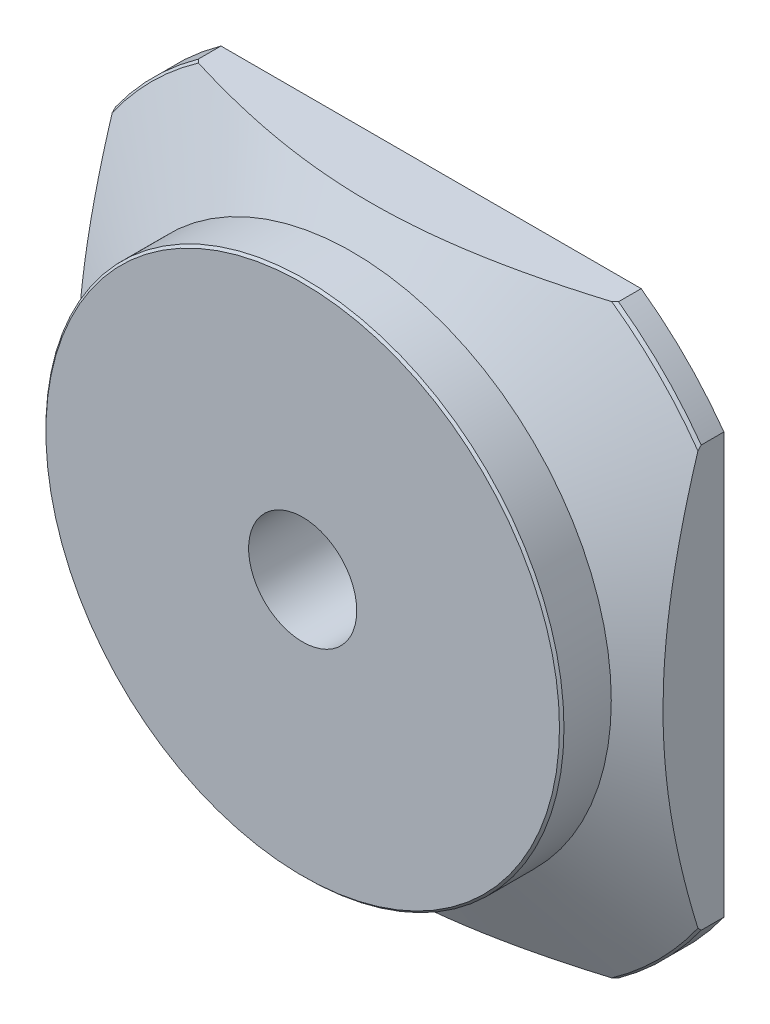
ISO-10303-21;
HEADER;
FILE_DESCRIPTION(('STEP AP214'),'2;1');
FILE_NAME('part.step','',(''),(''),'','','');
FILE_SCHEMA(('AUTOMOTIVE_DESIGN { 1 0 10303 214 1 1 1 1 }'));
ENDSEC;
DATA;
#1=APPLICATION_CONTEXT('core data for automotive mechanical design processes');
#2=APPLICATION_PROTOCOL_DEFINITION('international standard','automotive_design',2000,#1);
#3=PRODUCT_CONTEXT('',#1,'mechanical');
#4=PRODUCT('Part','Part','',(#3));
#5=PRODUCT_RELATED_PRODUCT_CATEGORY('part','',(#4));
#6=PRODUCT_DEFINITION_FORMATION('','',#4);
#7=PRODUCT_DEFINITION_CONTEXT('part definition',#1,'design');
#8=PRODUCT_DEFINITION('design','',#6,#7);
#9=PRODUCT_DEFINITION_SHAPE('','',#8);
#10=(LENGTH_UNIT() NAMED_UNIT(*) SI_UNIT(.MILLI.,.METRE.));
#11=(NAMED_UNIT(*) PLANE_ANGLE_UNIT() SI_UNIT($,.RADIAN.));
#12=(NAMED_UNIT(*) SI_UNIT($,.STERADIAN.) SOLID_ANGLE_UNIT());
#13=UNCERTAINTY_MEASURE_WITH_UNIT(LENGTH_MEASURE(1.E-05),#10,'distance_accuracy_value','');
#14=(GEOMETRIC_REPRESENTATION_CONTEXT(3) GLOBAL_UNCERTAINTY_ASSIGNED_CONTEXT((#13)) GLOBAL_UNIT_ASSIGNED_CONTEXT((#10,
#11,#12)) REPRESENTATION_CONTEXT('',''));
#15=CARTESIAN_POINT('',(0.,0.,0.));
#16=DIRECTION('',(0.,0.,1.));
#17=DIRECTION('',(1.,0.,0.));
#18=AXIS2_PLACEMENT_3D('',#15,#16,#17);
#19=CARTESIAN_POINT('',(-56.241548993449,57.440074272731,-69.2500021457751));
#20=DIRECTION('',(0.,1.,0.));
#21=DIRECTION('',(1.,0.,0.));
#22=AXIS2_PLACEMENT_3D('',#19,#20,#21);
#23=PLANE('',#22);
#24=CARTESIAN_POINT('',(-37.1170194345459,57.440074272731,-63.4787295908975));
#25=CARTESIAN_POINT('',(-31.2651213395303,57.440074272731,-61.6845540548488));
#26=CARTESIAN_POINT('',(-25.8756624168634,57.440074272731,-60.3370850560629));
#27=CARTESIAN_POINT('',(-20.0332533361199,57.440074272731,-58.8763697546775));
#28=CARTESIAN_POINT('',(-14.5372048499931,57.440074272731,-57.8904206273085));
#29=CARTESIAN_POINT('',(-8.6819049125293,57.440074272731,-56.840024533024));
#30=CARTESIAN_POINT('',(-3.0782490660757,57.440074272731,-56.3062009979771));
#31=CARTESIAN_POINT('',(2.7689702034313,57.440074272731,-55.7491747732818));
#32=CARTESIAN_POINT('',(8.52266911888411,57.440074272731,-55.7380522906249));
#33=CARTESIAN_POINT('',(14.3453683191257,57.440074272731,-55.7267964234301));
#34=CARTESIAN_POINT('',(20.2595439132772,57.440074272731,-56.2746703531966));
#35=CARTESIAN_POINT('',(25.9402012395056,57.440074272731,-56.8009117546281));
#36=CARTESIAN_POINT('',(31.8783630092681,57.440074272731,-57.8589996151785));
#37=CARTESIAN_POINT('',(37.4280803220118,57.440074272731,-58.8478727287407));
#38=CARTESIAN_POINT('',(43.3247803967278,57.440074272731,-60.3198828142651));
#39=CARTESIAN_POINT('',(48.7405221048772,57.440074272731,-61.6718298887269));
#40=CARTESIAN_POINT('',(54.6339214476564,57.440074272731,-63.4787295908984));
#41=B_SPLINE_CURVE_WITH_KNOTS('',2,(#24,#25,#26,#27,#28,#29,#30,#31,#32,#33,#34,#35,#36,#37,#38,
#39,#40),.UNSPECIFIED.,.F.,.F.,(3,2,2,2,2,2,2,2,3),(0.,0.125,0.25,0.375,0.5,0.625,0.75,0.875,
1.),.UNSPECIFIED.);
#42=CARTESIAN_POINT('',(-37.1170194345459,57.440074272731,-63.4787295908975));
#43=VERTEX_POINT('',#42);
#44=CARTESIAN_POINT('',(54.6339214476565,57.440074272731,-63.4787295908984));
#45=VERTEX_POINT('',#44);
#46=EDGE_CURVE('E200',#43,#45,#41,.T.);
#47=ORIENTED_EDGE('',*,*,#46,.T.);
#48=CARTESIAN_POINT('',(54.6339214476552,57.44007427272,-63.4787295908702));
#49=CARTESIAN_POINT('',(54.7611593552324,57.4400742727255,-63.600839097836));
#50=CARTESIAN_POINT('',(54.8882301053889,57.4400742727292,-63.7231218334181));
#51=CARTESIAN_POINT('',(55.1420372895521,57.4400742727328,-63.9680337605524));
#52=CARTESIAN_POINT('',(55.2687737235621,57.4400742727328,-64.0906629521009));
#53=CARTESIAN_POINT('',(55.3953430001549,57.440074272731,-64.2134653722623));
#54=B_SPLINE_CURVE_WITH_KNOTS('',3,(#48,#49,#50,#51,#52,#53),.UNSPECIFIED.,.F.,.F.,(4,2,4),(0.,
0.529056128119832,1.05811225078447),.UNSPECIFIED.);
#55=CARTESIAN_POINT('',(55.3953430001549,57.440074272731,-64.2134653722623));
#56=VERTEX_POINT('',#55);
#57=EDGE_CURVE('E84',#45,#56,#54,.T.);
#58=ORIENTED_EDGE('',*,*,#57,.T.);
#59=DIRECTION('',(0.,0.,1.));
#60=VECTOR('',#59,1.);
#61=CARTESIAN_POINT('',(55.3953430001549,57.440074272731,-69.2500021457751));
#62=LINE('',#61,#60);
#63=CARTESIAN_POINT('',(55.3953430001549,57.440074272731,-69.2500021457751));
#64=VERTEX_POINT('',#63);
#65=EDGE_CURVE('E171',#64,#56,#62,.T.);
#66=ORIENTED_EDGE('',*,*,#65,.F.);
#67=DIRECTION('',(1.,0.,0.));
#68=VECTOR('',#67,1.);
#69=CARTESIAN_POINT('',(55.3953430001549,57.440074272731,-69.2500021457751));
#70=LINE('',#69,#68);
#71=CARTESIAN_POINT('',(-37.8784409870529,57.440074272731,-69.2500021457751));
#72=VERTEX_POINT('',#71);
#73=EDGE_CURVE('E167',#72,#64,#70,.T.);
#74=ORIENTED_EDGE('',*,*,#73,.F.);
#75=DIRECTION('',(0.,0.,1.));
#76=VECTOR('',#75,1.);
#77=CARTESIAN_POINT('',(-37.8784409870529,57.440074272731,-69.2500021457751));
#78=LINE('',#77,#76);
#79=CARTESIAN_POINT('',(-37.8784409870529,57.440074272731,-64.2134653722622));
#80=VERTEX_POINT('',#79);
#81=EDGE_CURVE('E170',#72,#80,#78,.T.);
#82=ORIENTED_EDGE('',*,*,#81,.T.);
#83=CARTESIAN_POINT('',(-37.8784409870529,57.440074272731,-64.2134653722622));
#84=CARTESIAN_POINT('',(-37.7518717104609,57.440074272731,-64.0906629520992));
#85=CARTESIAN_POINT('',(-37.6251352764504,57.440074272731,-63.9680337605502));
#86=CARTESIAN_POINT('',(-37.3713280922838,57.440074272731,-63.7231218334176));
#87=CARTESIAN_POINT('',(-37.2442573421243,57.440074272731,-63.6008390978376));
#88=CARTESIAN_POINT('',(-37.1170194345429,57.440074272731,-63.4787295908752));
#89=B_SPLINE_CURVE_WITH_KNOTS('',3,(#83,#84,#85,#86,#87,#88),.UNSPECIFIED.,.F.,.F.,(4,2,4),(0.,
0.529056122666593,1.05811225078838),.UNSPECIFIED.);
#90=EDGE_CURVE('E76',#80,#43,#89,.T.);
#91=ORIENTED_EDGE('',*,*,#90,.T.);
#92=EDGE_LOOP('',(#47,#58,#66,#74,#82,#91));
#93=FACE_BOUND('',#92,.T.);
#94=ADVANCED_FACE('F60',(#93),#23,.T.);
#95=CARTESIAN_POINT('',(73.758451006551,57.440074272731,-69.2500021457751));
#96=DIRECTION('',(1.,0.,0.));
#97=DIRECTION('',(0.,1.,0.));
#98=AXIS2_PLACEMENT_3D('',#95,#96,#97);
#99=PLANE('',#98);
#100=CARTESIAN_POINT('',(73.758451006551,-7.559925727269,-55.7378249115664));
#101=CARTESIAN_POINT('',(73.758451006551,-13.352533093477,-55.7378249115664));
#102=CARTESIAN_POINT('',(73.758451006551,-19.2384098843729,-56.291226991328));
#103=CARTESIAN_POINT('',(73.758451006551,-24.8889538024296,-56.8225025968374));
#104=CARTESIAN_POINT('',(73.758451006551,-30.7961829202323,-57.879777211926));
#105=CARTESIAN_POINT('',(73.758451006551,-36.3178691391945,-58.8680474407206));
#106=CARTESIAN_POINT('',(73.758451006551,-42.1836480559005,-60.3342356749913));
#107=CARTESIAN_POINT('',(73.758451006551,-47.5730463266984,-61.6813495786431));
#108=CARTESIAN_POINT('',(73.758451006551,-53.4353961683746,-63.4787295908984));
#109=B_SPLINE_CURVE_WITH_KNOTS('',2,(#100,#101,#102,#103,#104,#105,#106,#107,#108),
.UNSPECIFIED.,.F.,.F.,(3,2,2,2,3),(0.,0.25,0.5,0.75,1.),.UNSPECIFIED.);
#110=CARTESIAN_POINT('',(73.758451006551,-7.55992572726901,-55.7378249115665));
#111=VERTEX_POINT('',#110);
#112=CARTESIAN_POINT('',(73.758451006551,-53.4353961683746,-63.4787295908984));
#113=VERTEX_POINT('',#112);
#114=EDGE_CURVE('E557',#111,#113,#109,.T.);
#115=ORIENTED_EDGE('',*,*,#114,.T.);
#116=CARTESIAN_POINT('',(73.75845100654,-53.4353961683733,-63.4787295908702));
#117=CARTESIAN_POINT('',(73.7584510065455,-53.5626340759505,-63.600839097836));
#118=CARTESIAN_POINT('',(73.7584510065492,-53.689704826107,-63.7231218334181));
#119=CARTESIAN_POINT('',(73.7584510065528,-53.9435120102701,-63.9680337605524));
#120=CARTESIAN_POINT('',(73.7584510065528,-54.0702484442802,-64.0906629521009));
#121=CARTESIAN_POINT('',(73.758451006551,-54.196817720873,-64.2134653722623));
#122=B_SPLINE_CURVE_WITH_KNOTS('',3,(#116,#117,#118,#119,#120,#121),.UNSPECIFIED.,.F.,.F.,(4,2,
4),(0.,0.529056128119808,1.05811225078444),.UNSPECIFIED.);
#123=CARTESIAN_POINT('',(73.758451006551,-54.196817720873,-64.2134653722622));
#124=VERTEX_POINT('',#123);
#125=EDGE_CURVE('E405',#113,#124,#122,.T.);
#126=ORIENTED_EDGE('',*,*,#125,.T.);
#127=DIRECTION('',(0.,0.,1.));
#128=VECTOR('',#127,1.);
#129=CARTESIAN_POINT('',(73.758451006551,-54.196817720873,-69.2500021457751));
#130=LINE('',#129,#128);
#131=CARTESIAN_POINT('',(73.758451006551,-54.196817720873,-69.2500021457751));
#132=VERTEX_POINT('',#131);
#133=EDGE_CURVE('E491',#132,#124,#130,.T.);
#134=ORIENTED_EDGE('',*,*,#133,.F.);
#135=DIRECTION('',(0.,-1.,0.));
#136=VECTOR('',#135,1.);
#137=CARTESIAN_POINT('',(73.758451006551,-54.196817720873,-69.2500021457751));
#138=LINE('',#137,#136);
#139=CARTESIAN_POINT('',(73.758451006551,39.0769662663349,-69.2500021457751));
#140=VERTEX_POINT('',#139);
#141=EDGE_CURVE('E474',#140,#132,#138,.T.);
#142=ORIENTED_EDGE('',*,*,#141,.F.);
#143=DIRECTION('',(0.,0.,1.));
#144=VECTOR('',#143,1.);
#145=CARTESIAN_POINT('',(73.758451006551,39.0769662663349,-69.2500021457751));
#146=LINE('',#145,#144);
#147=CARTESIAN_POINT('',(73.758451006551,39.0769662663349,-64.2134653722623));
#148=VERTEX_POINT('',#147);
#149=EDGE_CURVE('E194',#140,#148,#146,.T.);
#150=ORIENTED_EDGE('',*,*,#149,.T.);
#151=CARTESIAN_POINT('',(73.758451006551,39.0769662663349,-64.2134653722623));
#152=CARTESIAN_POINT('',(73.758451006551,38.9503969897436,-64.0906629520998));
#153=CARTESIAN_POINT('',(73.758451006551,38.8236605557337,-63.9680337605515));
#154=CARTESIAN_POINT('',(73.758451006551,38.5698533715684,-63.7231218334201));
#155=CARTESIAN_POINT('',(73.758451006551,38.4427826214096,-63.6008390978408));
#156=CARTESIAN_POINT('',(73.758451006551,38.3155447138288,-63.478729590879));
#157=B_SPLINE_CURVE_WITH_KNOTS('',3,(#151,#152,#153,#154,#155,#156),.UNSPECIFIED.,.F.,.F.,(4,2,
4),(0.,0.529056122663889,1.05811225078298),.UNSPECIFIED.);
#158=CARTESIAN_POINT('',(73.758451006551,38.3155447138462,-63.4787295908783));
#159=VERTEX_POINT('',#158);
#160=EDGE_CURVE('E410',#148,#159,#157,.T.);
#161=ORIENTED_EDGE('',*,*,#160,.T.);
#162=CARTESIAN_POINT('',(73.758451006551,38.3155447138462,-63.4787295908783));
#163=CARTESIAN_POINT('',(73.758451006551,32.4328900250772,-61.6751241695012));
#164=CARTESIAN_POINT('',(73.758451006551,27.0172243231625,-60.3228416867446));
#165=CARTESIAN_POINT('',(73.758451006551,21.1443419558022,-58.856392982966));
#166=CARTESIAN_POINT('',(73.758451006551,15.6207000656451,-57.8698306908073));
#167=CARTESIAN_POINT('',(73.758451006551,9.7353131289027,-56.8186581235017));
#168=CARTESIAN_POINT('',(73.758451006551,4.10222071063501,-56.2896918599017));
#169=CARTESIAN_POINT('',(73.758451006551,-1.77474675682229,-55.7378249115664));
#170=CARTESIAN_POINT('',(73.758451006551,-7.559925727269,-55.7378249115664));
#171=B_SPLINE_CURVE_WITH_KNOTS('',2,(#162,#163,#164,#165,#166,#167,#168,#169,#170),
.UNSPECIFIED.,.F.,.F.,(3,2,2,2,3),(0.,0.25,0.5,0.75,1.),.UNSPECIFIED.);
#172=EDGE_CURVE('E469',#159,#111,#171,.T.);
#173=ORIENTED_EDGE('',*,*,#172,.T.);
#174=EDGE_LOOP('',(#115,#126,#134,#142,#150,#161,#173));
#175=FACE_BOUND('',#174,.T.);
#176=ADVANCED_FACE('F217',(#175),#99,.T.);
#177=CARTESIAN_POINT('',(73.758451006551,-72.559925727269,-69.2500021457751));
#178=DIRECTION('',(0.,-1.,0.));
#179=DIRECTION('',(0.,0.,-1.));
#180=AXIS2_PLACEMENT_3D('',#177,#178,#179);
#181=PLANE('',#180);
#182=DIRECTION('',(0.,0.,1.));
#183=VECTOR('',#182,1.);
#184=CARTESIAN_POINT('',(55.3953430001549,-72.559925727269,-69.2500021457751));
#185=LINE('',#184,#183);
#186=CARTESIAN_POINT('',(55.3953430001549,-72.559925727269,-69.2500021457751));
#187=VERTEX_POINT('',#186);
#188=CARTESIAN_POINT('',(55.3953430001549,-72.559925727269,-64.2134653722622));
#189=VERTEX_POINT('',#188);
#190=EDGE_CURVE('E489',#187,#189,#185,.T.);
#191=ORIENTED_EDGE('',*,*,#190,.T.);
#192=CARTESIAN_POINT('',(55.3953430001549,-72.559925727269,-64.2134653722622));
#193=CARTESIAN_POINT('',(55.2687737235636,-72.559925727269,-64.0906629520998));
#194=CARTESIAN_POINT('',(55.1420372895537,-72.559925727269,-63.9680337605514));
#195=CARTESIAN_POINT('',(54.8882301053885,-72.559925727269,-63.7231218334201));
#196=CARTESIAN_POINT('',(54.7611593552296,-72.559925727269,-63.6008390978407));
#197=CARTESIAN_POINT('',(54.6339214476488,-72.559925727269,-63.478729590879));
#198=B_SPLINE_CURVE_WITH_KNOTS('',3,(#192,#193,#194,#195,#196,#197),.UNSPECIFIED.,.F.,.F.,(4,2,
4),(0.,0.529056122663844,1.0581122507829),.UNSPECIFIED.);
#199=CARTESIAN_POINT('',(54.6339214476662,-72.559925727269,-63.4787295908783));
#200=VERTEX_POINT('',#199);
#201=EDGE_CURVE('E380',#189,#200,#198,.T.);
#202=ORIENTED_EDGE('',*,*,#201,.T.);
#203=CARTESIAN_POINT('',(54.6339214476662,-72.559925727269,-63.4787295908783));
#204=CARTESIAN_POINT('',(48.7820233528648,-72.559925727269,-61.6845540549115));
#205=CARTESIAN_POINT('',(43.3925644299692,-72.559925727269,-60.3370850560592));
#206=CARTESIAN_POINT('',(37.5501553506917,-72.559925727269,-58.8763697550306));
#207=CARTESIAN_POINT('',(32.0541068630971,-72.559925727269,-57.8904206273089));
#208=CARTESIAN_POINT('',(26.1988069274966,-72.559925727269,-56.8400245332633));
#209=CARTESIAN_POINT('',(20.5951510791794,-72.559925727269,-56.3062009979773));
#210=CARTESIAN_POINT('',(14.7479318107685,-72.559925727269,-55.749174773322));
#211=CARTESIAN_POINT('',(8.99423289421919,-72.559925727269,-55.7380522906249));
#212=CARTESIAN_POINT('',(3.1715336931948,-72.559925727269,-55.7267964233901));
#213=CARTESIAN_POINT('',(-2.7426419001742,-72.559925727269,-56.2746703531965));
#214=CARTESIAN_POINT('',(-8.4232992261907,-72.559925727269,-56.8009117547163));
#215=CARTESIAN_POINT('',(-14.3614609961655,-72.559925727269,-57.8589996151784));
#216=CARTESIAN_POINT('',(-19.9111783042189,-72.559925727269,-58.8478727277869));
#217=CARTESIAN_POINT('',(-25.8078783836255,-72.559925727269,-60.319882814265));
#218=CARTESIAN_POINT('',(-31.2236200882728,-72.559925727269,-61.6718298876531));
#219=CARTESIAN_POINT('',(-37.1170194345544,-72.559925727269,-63.4787295908986));
#220=B_SPLINE_CURVE_WITH_KNOTS('',2,(#203,#204,#205,#206,#207,#208,#209,#210,#211,#212,#213,
#214,#215,#216,#217,#218,#219),.UNSPECIFIED.,.F.,.F.,(3,2,2,2,2,2,2,2,3),(0.,0.125,0.25,0.375,
0.5,0.625,0.75,0.875,1.),.UNSPECIFIED.);
#221=CARTESIAN_POINT('',(-37.1170194345544,-72.559925727269,-63.4787295908986));
#222=VERTEX_POINT('',#221);
#223=EDGE_CURVE('E552',#200,#222,#220,.T.);
#224=ORIENTED_EDGE('',*,*,#223,.T.);
#225=CARTESIAN_POINT('',(-37.1170194345532,-72.559925727258,-63.4787295908702));
#226=CARTESIAN_POINT('',(-37.2442573421304,-72.5599257272635,-63.600839097836));
#227=CARTESIAN_POINT('',(-37.371328092287,-72.5599257272672,-63.7231218334181));
#228=CARTESIAN_POINT('',(-37.6251352764501,-72.5599257272708,-63.9680337605523));
#229=CARTESIAN_POINT('',(-37.7518717104602,-72.5599257272708,-64.0906629521009));
#230=CARTESIAN_POINT('',(-37.8784409870529,-72.559925727269,-64.2134653722622));
#231=B_SPLINE_CURVE_WITH_KNOTS('',3,(#225,#226,#227,#228,#229,#230),.UNSPECIFIED.,.F.,.F.,(4,2,
4),(0.,0.529056128119814,1.05811225078446),.UNSPECIFIED.);
#232=CARTESIAN_POINT('',(-37.8784409870529,-72.559925727269,-64.2134653722622));
#233=VERTEX_POINT('',#232);
#234=EDGE_CURVE('E378',#222,#233,#231,.T.);
#235=ORIENTED_EDGE('',*,*,#234,.T.);
#236=DIRECTION('',(0.,0.,1.));
#237=VECTOR('',#236,1.);
#238=CARTESIAN_POINT('',(-37.8784409870529,-72.559925727269,-69.2500021457751));
#239=LINE('',#238,#237);
#240=CARTESIAN_POINT('',(-37.8784409870529,-72.559925727269,-69.2500021457751));
#241=VERTEX_POINT('',#240);
#242=EDGE_CURVE('E487',#241,#233,#239,.T.);
#243=ORIENTED_EDGE('',*,*,#242,.F.);
#244=DIRECTION('',(-1.,0.,0.));
#245=VECTOR('',#244,1.);
#246=CARTESIAN_POINT('',(-37.8784409870529,-72.559925727269,-69.2500021457751));
#247=LINE('',#246,#245);
#248=EDGE_CURVE('E478',#187,#241,#247,.T.);
#249=ORIENTED_EDGE('',*,*,#248,.F.);
#250=EDGE_LOOP('',(#191,#202,#224,#235,#243,#249));
#251=FACE_BOUND('',#250,.T.);
#252=ADVANCED_FACE('F271',(#251),#181,.T.);
#253=CARTESIAN_POINT('',(-56.241548993449,-72.559925727269,-69.2500021457751));
#254=DIRECTION('',(-1.,0.,0.));
#255=DIRECTION('',(0.,0.,1.));
#256=AXIS2_PLACEMENT_3D('',#253,#254,#255);
#257=PLANE('',#256);
#258=DIRECTION('',(0.,0.,1.));
#259=VECTOR('',#258,1.);
#260=CARTESIAN_POINT('',(-56.241548993449,-54.196817720873,-69.2500021457751));
#261=LINE('',#260,#259);
#262=CARTESIAN_POINT('',(-56.241548993449,-54.196817720873,-69.2500021457751));
#263=VERTEX_POINT('',#262);
#264=CARTESIAN_POINT('',(-56.241548993449,-54.196817720873,-64.2134653722622));
#265=VERTEX_POINT('',#264);
#266=EDGE_CURVE('E485',#263,#265,#261,.T.);
#267=ORIENTED_EDGE('',*,*,#266,.T.);
#268=CARTESIAN_POINT('',(-56.241548993449,-54.196817720873,-64.2134653722622));
#269=CARTESIAN_POINT('',(-56.241548993449,-54.0702484442816,-64.0906629520998));
#270=CARTESIAN_POINT('',(-56.241548993449,-53.9435120102717,-63.9680337605514));
#271=CARTESIAN_POINT('',(-56.241548993449,-53.6897048261065,-63.7231218334201));
#272=CARTESIAN_POINT('',(-56.241548993449,-53.5626340759476,-63.6008390978407));
#273=CARTESIAN_POINT('',(-56.241548993449,-53.4353961683669,-63.478729590879));
#274=B_SPLINE_CURVE_WITH_KNOTS('',3,(#268,#269,#270,#271,#272,#273),.UNSPECIFIED.,.F.,.F.,(4,2,
4),(0.,0.529056122663884,1.05811225078296),.UNSPECIFIED.);
#275=CARTESIAN_POINT('',(-56.241548993449,-53.4353961683842,-63.4787295908783));
#276=VERTEX_POINT('',#275);
#277=EDGE_CURVE('E264',#265,#276,#274,.T.);
#278=ORIENTED_EDGE('',*,*,#277,.T.);
#279=CARTESIAN_POINT('',(-56.241548993449,-53.4353961683842,-63.4787295908783));
#280=CARTESIAN_POINT('',(-56.241548993449,-47.5527414785098,-61.6751241691622));
#281=CARTESIAN_POINT('',(-56.241548993449,-42.1370757777005,-60.3228416867446));
#282=CARTESIAN_POINT('',(-56.241548993449,-36.264193408874,-58.8563929826681));
#283=CARTESIAN_POINT('',(-56.241548993449,-30.7405515201831,-57.8698306908073));
#284=CARTESIAN_POINT('',(-56.241548993449,-24.8551645832056,-56.818658123498));
#285=CARTESIAN_POINT('',(-56.241548993449,-19.222072165173,-56.2896918599016));
#286=CARTESIAN_POINT('',(-56.241548993449,-13.345104697921,-55.7378249115664));
#287=CARTESIAN_POINT('',(-56.241548993449,-7.559925727269,-55.7378249115664));
#288=B_SPLINE_CURVE_WITH_KNOTS('',2,(#279,#280,#281,#282,#283,#284,#285,#286,#287),
.UNSPECIFIED.,.F.,.F.,(3,2,2,2,3),(0.,0.25,0.5,0.75,1.),.UNSPECIFIED.);
#289=CARTESIAN_POINT('',(-56.241548993449,-7.55992572726902,-55.7378249115664));
#290=VERTEX_POINT('',#289);
#291=EDGE_CURVE('E558',#276,#290,#288,.T.);
#292=ORIENTED_EDGE('',*,*,#291,.T.);
#293=CARTESIAN_POINT('',(-56.241548993449,-7.559925727269,-55.7378249115664));
#294=CARTESIAN_POINT('',(-56.241548993449,-1.7673183615487,-55.7378249115664));
#295=CARTESIAN_POINT('',(-56.241548993449,4.1185584298335,-56.2912269913279));
#296=CARTESIAN_POINT('',(-56.241548993449,9.7691023468995,-56.8225025967001));
#297=CARTESIAN_POINT('',(-56.241548993449,15.6763314656915,-57.8797772119255));
#298=CARTESIAN_POINT('',(-56.241548993449,21.1980176849126,-58.8680474407288));
#299=CARTESIAN_POINT('',(-56.241548993449,27.0637966013585,-60.3342356749935));
#300=CARTESIAN_POINT('',(-56.241548993449,32.4531948730764,-61.6813495789296));
#301=CARTESIAN_POINT('',(-56.241548993449,38.3155447138192,-63.4787295909191));
#302=B_SPLINE_CURVE_WITH_KNOTS('',2,(#293,#294,#295,#296,#297,#298,#299,#300,#301),
.UNSPECIFIED.,.F.,.F.,(3,2,2,2,3),(0.,0.25,0.5,0.75,1.),.UNSPECIFIED.);
#303=CARTESIAN_POINT('',(-56.241548993449,38.3155447138193,-63.4787295909191));
#304=VERTEX_POINT('',#303);
#305=EDGE_CURVE('E192',#290,#304,#302,.T.);
#306=ORIENTED_EDGE('',*,*,#305,.T.);
#307=CARTESIAN_POINT('',(-56.2415489934427,38.3155447138286,-63.4787295908702));
#308=CARTESIAN_POINT('',(-56.2415489934458,38.442782621408,-63.6008390978348));
#309=CARTESIAN_POINT('',(-56.2415489934479,38.5698533715662,-63.7231218334164));
#310=CARTESIAN_POINT('',(-56.24154899345,38.8236605557315,-63.9680337605507));
#311=CARTESIAN_POINT('',(-56.24154899345,38.9503969897421,-64.0906629520998));
#312=CARTESIAN_POINT('',(-56.241548993449,39.0769662663349,-64.2134653722622));
#313=B_SPLINE_CURVE_WITH_KNOTS('',3,(#307,#308,#309,#310,#311,#312),.UNSPECIFIED.,.F.,.F.,(4,2,
4),(0.,0.529056128122183,1.05811225078918),.UNSPECIFIED.);
#314=CARTESIAN_POINT('',(-56.241548993449,39.0769662663349,-64.2134653722622));
#315=VERTEX_POINT('',#314);
#316=EDGE_CURVE('E262',#304,#315,#313,.T.);
#317=ORIENTED_EDGE('',*,*,#316,.T.);
#318=DIRECTION('',(0.,0.,1.));
#319=VECTOR('',#318,1.);
#320=CARTESIAN_POINT('',(-56.241548993449,39.0769662663349,-69.2500021457751));
#321=LINE('',#320,#319);
#322=CARTESIAN_POINT('',(-56.241548993449,39.0769662663349,-69.2500021457751));
#323=VERTEX_POINT('',#322);
#324=EDGE_CURVE('E483',#323,#315,#321,.T.);
#325=ORIENTED_EDGE('',*,*,#324,.F.);
#326=DIRECTION('',(0.,1.,0.));
#327=VECTOR('',#326,1.);
#328=CARTESIAN_POINT('',(-56.241548993449,39.0769662663349,-69.2500021457751));
#329=LINE('',#328,#327);
#330=EDGE_CURVE('E180',#263,#323,#329,.T.);
#331=ORIENTED_EDGE('',*,*,#330,.F.);
#332=EDGE_LOOP('',(#267,#278,#292,#306,#317,#325,#331));
#333=FACE_BOUND('',#332,.T.);
#334=ADVANCED_FACE('F266',(#333),#257,.T.);
#335=CARTESIAN_POINT('',(8.75845100655098,-7.55992572726902,-63.4787295908816));
#336=DIRECTION('',(0.,0.,-1.));
#337=DIRECTION('',(-1.,0.,0.));
#338=AXIS2_PLACEMENT_3D('',#335,#336,#337);
#339=CONICAL_SURFACE('',#338,79.558524296235,1.08210413624001);
#340=ORIENTED_EDGE('',*,*,#223,.F.);
#341=CARTESIAN_POINT('',(8.75845100655098,-7.55992572726902,-63.4787295908702));
#342=DIRECTION('',(0.,0.,-1.));
#343=DIRECTION('',(-1.,0.,0.));
#344=AXIS2_PLACEMENT_3D('',#341,#342,#343);
#345=CIRCLE('',#344,79.5585242962135);
#346=EDGE_CURVE('E426',#200,#113,#345,.F.);
#347=ORIENTED_EDGE('',*,*,#346,.T.);
#348=ORIENTED_EDGE('',*,*,#114,.F.);
#349=ORIENTED_EDGE('',*,*,#172,.F.);
#350=CARTESIAN_POINT('',(8.75845100655098,-7.55992572726902,-63.4787295908702));
#351=DIRECTION('',(0.,0.,-1.));
#352=DIRECTION('',(-1.,0.,0.));
#353=AXIS2_PLACEMENT_3D('',#350,#351,#352);
#354=CIRCLE('',#353,79.5585242962135);
#355=EDGE_CURVE('E434',#159,#45,#354,.F.);
#356=ORIENTED_EDGE('',*,*,#355,.T.);
#357=ORIENTED_EDGE('',*,*,#46,.F.);
#358=CARTESIAN_POINT('',(8.75845100655098,-7.55992572726902,-63.4787295908702));
#359=DIRECTION('',(0.,0.,-1.));
#360=DIRECTION('',(-1.,0.,0.));
#361=AXIS2_PLACEMENT_3D('',#358,#359,#360);
#362=CIRCLE('',#361,79.5585242962135);
#363=EDGE_CURVE('E438',#43,#304,#362,.F.);
#364=ORIENTED_EDGE('',*,*,#363,.T.);
#365=ORIENTED_EDGE('',*,*,#305,.F.);
#366=ORIENTED_EDGE('',*,*,#291,.F.);
#367=CARTESIAN_POINT('',(8.75845100655098,-7.55992572726902,-63.4787295908702));
#368=DIRECTION('',(0.,0.,-1.));
#369=DIRECTION('',(-1.,0.,0.));
#370=AXIS2_PLACEMENT_3D('',#367,#368,#369);
#371=CIRCLE('',#370,79.5585242962135);
#372=EDGE_CURVE('E430',#276,#222,#371,.F.);
#373=ORIENTED_EDGE('',*,*,#372,.T.);
#374=EDGE_LOOP('',(#340,#347,#348,#349,#356,#357,#364,#365,#366,#373));
#375=FACE_BOUND('',#374,.T.);
#376=CARTESIAN_POINT('',(8.75845100655098,-7.55992572726902,-51.7500021458221));
#377=DIRECTION('',(0.,0.,1.));
#378=DIRECTION('',(1.,0.,0.));
#379=AXIS2_PLACEMENT_3D('',#376,#377,#378);
#380=CIRCLE('',#379,57.4999961853113);
#381=CARTESIAN_POINT('',(66.2584471918623,-7.55992572726902,-51.7500021458221));
#382=VERTEX_POINT('',#381);
#383=EDGE_CURVE('E188',#382,#382,#380,.T.);
#384=ORIENTED_EDGE('',*,*,#383,.F.);
#385=EDGE_LOOP('',(#384));
#386=FACE_BOUND('',#385,.T.);
#387=ADVANCED_FACE('F218',(#375,#386),#339,.T.);
#388=CARTESIAN_POINT('',(8.75845100655098,-7.55992572726902,-40.7500040531269));
#389=DIRECTION('',(0.,0.,-1.));
#390=DIRECTION('',(-1.,0.,0.));
#391=AXIS2_PLACEMENT_3D('',#388,#389,#390);
#392=CYLINDRICAL_SURFACE('',#391,57.4999961853113);
#393=CARTESIAN_POINT('',(8.75845100655098,-7.55992572726902,-41.2500021457874));
#394=DIRECTION('',(0.,0.,1.));
#395=DIRECTION('',(1.,0.,0.));
#396=AXIS2_PLACEMENT_3D('',#393,#394,#395);
#397=CIRCLE('',#396,57.4999961853113);
#398=CARTESIAN_POINT('',(66.2584471918623,-7.55992572726902,-41.2500021457874));
#399=VERTEX_POINT('',#398);
#400=EDGE_CURVE('E12',#399,#399,#397,.F.);
#401=ORIENTED_EDGE('',*,*,#400,.T.);
#402=EDGE_LOOP('',(#401));
#403=FACE_BOUND('',#402,.T.);
#404=ORIENTED_EDGE('',*,*,#383,.T.);
#405=EDGE_LOOP('',(#404));
#406=FACE_BOUND('',#405,.T.);
#407=ADVANCED_FACE('F273',(#403,#406),#392,.T.);
#408=CARTESIAN_POINT('',(8.75845100655098,-7.55992572726902,-40.7500040531269));
#409=DIRECTION('',(0.,0.,1.));
#410=DIRECTION('',(1.,0.,0.));
#411=AXIS2_PLACEMENT_3D('',#408,#409,#410);
#412=PLANE('',#411);
#413=CARTESIAN_POINT('',(8.75845100655098,-7.55992572726902,-40.7500040531269));
#414=DIRECTION('',(0.,0.,1.));
#415=DIRECTION('',(1.,0.,0.));
#416=AXIS2_PLACEMENT_3D('',#413,#414,#415);
#417=CIRCLE('',#416,12.);
#418=CARTESIAN_POINT('',(20.758451006551,-7.55992572726902,-40.7500040531269));
#419=VERTEX_POINT('',#418);
#420=EDGE_CURVE('E600',#419,#419,#417,.T.);
#421=ORIENTED_EDGE('',*,*,#420,.F.);
#422=EDGE_LOOP('',(#421));
#423=FACE_BOUND('',#422,.T.);
#424=CARTESIAN_POINT('',(8.75845100655098,-7.55992572726902,-40.7500040531269));
#425=DIRECTION('',(0.,0.,1.));
#426=DIRECTION('',(1.,0.,0.));
#427=AXIS2_PLACEMENT_3D('',#424,#425,#426);
#428=CIRCLE('',#427,56.9999980926543);
#429=CARTESIAN_POINT('',(65.7584490992053,-7.55992572726902,-40.7500040531269));
#430=VERTEX_POINT('',#429);
#431=EDGE_CURVE('E69',#430,#430,#428,.T.);
#432=ORIENTED_EDGE('',*,*,#431,.T.);
#433=EDGE_LOOP('',(#432));
#434=FACE_BOUND('',#433,.T.);
#435=ADVANCED_FACE('F531',(#423,#434),#412,.T.);
#436=CARTESIAN_POINT('',(8.75845100655098,-7.55992572726902,-69.2500021457751));
#437=DIRECTION('',(0.,0.,1.));
#438=DIRECTION('',(1.,0.,0.));
#439=AXIS2_PLACEMENT_3D('',#436,#437,#438);
#440=CYLINDRICAL_SURFACE('',#439,79.9999980926442);
#441=ORIENTED_EDGE('',*,*,#324,.T.);
#442=CARTESIAN_POINT('',(8.75845100655098,-7.55992572726902,-64.2134653722622));
#443=DIRECTION('',(0.,0.,1.));
#444=DIRECTION('',(1.,0.,0.));
#445=AXIS2_PLACEMENT_3D('',#442,#443,#444);
#446=CIRCLE('',#445,79.9999980926442);
#447=EDGE_CURVE('E187',#315,#80,#446,.F.);
#448=ORIENTED_EDGE('',*,*,#447,.T.);
#449=ORIENTED_EDGE('',*,*,#81,.F.);
#450=CARTESIAN_POINT('',(8.75845100655098,-7.55992572726902,-69.2500021457751));
#451=DIRECTION('',(0.,0.,-1.));
#452=DIRECTION('',(1.,0.,0.));
#453=AXIS2_PLACEMENT_3D('',#450,#451,#452);
#454=CIRCLE('',#453,79.9999980926442);
#455=EDGE_CURVE('E175',#323,#72,#454,.T.);
#456=ORIENTED_EDGE('',*,*,#455,.F.);
#457=EDGE_LOOP('',(#441,#448,#449,#456));
#458=FACE_BOUND('',#457,.T.);
#459=ADVANCED_FACE('F186',(#458),#440,.T.);
#460=CARTESIAN_POINT('',(8.75845100655098,-7.55992572726902,-69.2500021457751));
#461=DIRECTION('',(0.,0.,1.));
#462=DIRECTION('',(1.,0.,0.));
#463=AXIS2_PLACEMENT_3D('',#460,#461,#462);
#464=CYLINDRICAL_SURFACE('',#463,79.9999980926442);
#465=ORIENTED_EDGE('',*,*,#65,.T.);
#466=CARTESIAN_POINT('',(8.75845100655098,-7.55992572726902,-64.2134653722623));
#467=DIRECTION('',(0.,0.,1.));
#468=DIRECTION('',(1.,0.,0.));
#469=AXIS2_PLACEMENT_3D('',#466,#467,#468);
#470=CIRCLE('',#469,79.9999980926442);
#471=EDGE_CURVE('E394',#56,#148,#470,.F.);
#472=ORIENTED_EDGE('',*,*,#471,.T.);
#473=ORIENTED_EDGE('',*,*,#149,.F.);
#474=CARTESIAN_POINT('',(8.75845100655098,-7.55992572726902,-69.2500021457751));
#475=DIRECTION('',(0.,0.,-1.));
#476=DIRECTION('',(1.,0.,0.));
#477=AXIS2_PLACEMENT_3D('',#474,#475,#476);
#478=CIRCLE('',#477,79.9999980926442);
#479=EDGE_CURVE('E174',#64,#140,#478,.T.);
#480=ORIENTED_EDGE('',*,*,#479,.F.);
#481=EDGE_LOOP('',(#465,#472,#473,#480));
#482=FACE_BOUND('',#481,.T.);
#483=ADVANCED_FACE('F497',(#482),#464,.T.);
#484=CARTESIAN_POINT('',(8.75845100655098,-7.55992572726902,-69.2500021457751));
#485=DIRECTION('',(0.,0.,1.));
#486=DIRECTION('',(1.,0.,0.));
#487=AXIS2_PLACEMENT_3D('',#484,#485,#486);
#488=CYLINDRICAL_SURFACE('',#487,79.9999980926442);
#489=ORIENTED_EDGE('',*,*,#133,.T.);
#490=CARTESIAN_POINT('',(8.75845100655098,-7.55992572726902,-64.2134653722622));
#491=DIRECTION('',(0.,0.,1.));
#492=DIRECTION('',(1.,0.,0.));
#493=AXIS2_PLACEMENT_3D('',#490,#491,#492);
#494=CIRCLE('',#493,79.9999980926442);
#495=EDGE_CURVE('E448',#124,#189,#494,.F.);
#496=ORIENTED_EDGE('',*,*,#495,.T.);
#497=ORIENTED_EDGE('',*,*,#190,.F.);
#498=CARTESIAN_POINT('',(8.75845100655098,-7.55992572726902,-69.2500021457751));
#499=DIRECTION('',(0.,0.,-1.));
#500=DIRECTION('',(1.,0.,0.));
#501=AXIS2_PLACEMENT_3D('',#498,#499,#500);
#502=CIRCLE('',#501,79.9999980926442);
#503=EDGE_CURVE('E476',#132,#187,#502,.T.);
#504=ORIENTED_EDGE('',*,*,#503,.F.);
#505=EDGE_LOOP('',(#489,#496,#497,#504));
#506=FACE_BOUND('',#505,.T.);
#507=ADVANCED_FACE('F500',(#506),#488,.T.);
#508=CARTESIAN_POINT('',(8.75845100655098,-7.55992572726902,-69.2500021457751));
#509=DIRECTION('',(0.,0.,1.));
#510=DIRECTION('',(1.,0.,0.));
#511=AXIS2_PLACEMENT_3D('',#508,#509,#510);
#512=CYLINDRICAL_SURFACE('',#511,79.9999980926442);
#513=ORIENTED_EDGE('',*,*,#242,.T.);
#514=CARTESIAN_POINT('',(8.75845100655098,-7.55992572726902,-64.2134653722622));
#515=DIRECTION('',(0.,0.,1.));
#516=DIRECTION('',(1.,0.,0.));
#517=AXIS2_PLACEMENT_3D('',#514,#515,#516);
#518=CIRCLE('',#517,79.9999980926442);
#519=EDGE_CURVE('E402',#233,#265,#518,.F.);
#520=ORIENTED_EDGE('',*,*,#519,.T.);
#521=ORIENTED_EDGE('',*,*,#266,.F.);
#522=CARTESIAN_POINT('',(8.75845100655098,-7.55992572726902,-69.2500021457751));
#523=DIRECTION('',(0.,0.,-1.));
#524=DIRECTION('',(1.,0.,0.));
#525=AXIS2_PLACEMENT_3D('',#522,#523,#524);
#526=CIRCLE('',#525,79.9999980926442);
#527=EDGE_CURVE('E480',#241,#263,#526,.T.);
#528=ORIENTED_EDGE('',*,*,#527,.F.);
#529=EDGE_LOOP('',(#513,#520,#521,#528));
#530=FACE_BOUND('',#529,.T.);
#531=ADVANCED_FACE('F503',(#530),#512,.T.);
#532=CARTESIAN_POINT('',(8.75845100655098,-7.55992572726902,-69.2500021457751));
#533=DIRECTION('',(0.,0.,1.));
#534=DIRECTION('',(1.,0.,0.));
#535=AXIS2_PLACEMENT_3D('',#532,#533,#534);
#536=PLANE('',#535);
#537=CARTESIAN_POINT('',(8.75845100655098,-7.55992572726902,-69.2500021457751));
#538=DIRECTION('',(0.,0.,-1.));
#539=DIRECTION('',(-1.,0.,0.));
#540=AXIS2_PLACEMENT_3D('',#537,#538,#539);
#541=CIRCLE('',#540,13.9999980926457);
#542=CARTESIAN_POINT('',(-5.24154708609472,-7.55992572726902,-69.2500021457751));
#543=VERTEX_POINT('',#542);
#544=EDGE_CURVE('E452',#543,#543,#541,.T.);
#545=ORIENTED_EDGE('',*,*,#544,.F.);
#546=EDGE_LOOP('',(#545));
#547=FACE_BOUND('',#546,.T.);
#548=ORIENTED_EDGE('',*,*,#455,.T.);
#549=ORIENTED_EDGE('',*,*,#73,.T.);
#550=ORIENTED_EDGE('',*,*,#479,.T.);
#551=ORIENTED_EDGE('',*,*,#141,.T.);
#552=ORIENTED_EDGE('',*,*,#503,.T.);
#553=ORIENTED_EDGE('',*,*,#248,.T.);
#554=ORIENTED_EDGE('',*,*,#527,.T.);
#555=ORIENTED_EDGE('',*,*,#330,.T.);
#556=EDGE_LOOP('',(#548,#549,#550,#551,#552,#553,#554,#555));
#557=FACE_BOUND('',#556,.T.);
#558=ADVANCED_FACE('F178',(#547,#557),#536,.F.);
#559=CARTESIAN_POINT('',(8.75845100655098,-7.55992572726902,-69.2500021457751));
#560=DIRECTION('',(0.,0.,-1.));
#561=DIRECTION('',(-1.,0.,0.));
#562=AXIS2_PLACEMENT_3D('',#559,#560,#561);
#563=CYLINDRICAL_SURFACE('',#562,13.9999980926457);
#564=ORIENTED_EDGE('',*,*,#544,.T.);
#565=EDGE_LOOP('',(#564));
#566=FACE_BOUND('',#565,.T.);
#567=CARTESIAN_POINT('',(8.75845100655098,-7.55992572726902,-75.2500002384146));
#568=DIRECTION('',(0.,0.,-1.));
#569=DIRECTION('',(-1.,0.,0.));
#570=AXIS2_PLACEMENT_3D('',#567,#568,#569);
#571=CIRCLE('',#570,13.9999980926457);
#572=CARTESIAN_POINT('',(-5.24154708609472,-7.55992572726902,-75.2500002384146));
#573=VERTEX_POINT('',#572);
#574=EDGE_CURVE('E184',#573,#573,#571,.T.);
#575=ORIENTED_EDGE('',*,*,#574,.F.);
#576=EDGE_LOOP('',(#575));
#577=FACE_BOUND('',#576,.T.);
#578=ADVANCED_FACE('F583',(#566,#577),#563,.T.);
#579=CARTESIAN_POINT('',(8.75845100655098,-7.55992572726902,-91.2500002384137));
#580=DIRECTION('',(0.,0.,-1.));
#581=DIRECTION('',(-1.,0.,0.));
#582=AXIS2_PLACEMENT_3D('',#579,#580,#581);
#583=PLANE('',#582);
#584=CARTESIAN_POINT('',(8.75845100655098,-7.55992572726902,-91.2500002384137));
#585=DIRECTION('',(0.,0.,-1.));
#586=DIRECTION('',(-1.,0.,0.));
#587=AXIS2_PLACEMENT_3D('',#584,#585,#586);
#588=CIRCLE('',#587,25.500001907345);
#589=CARTESIAN_POINT('',(-16.741550900794,-7.55992572726902,-91.2500002384137));
#590=VERTEX_POINT('',#589);
#591=EDGE_CURVE('E523',#590,#590,#588,.T.);
#592=ORIENTED_EDGE('',*,*,#591,.T.);
#593=EDGE_LOOP('',(#592));
#594=FACE_BOUND('',#593,.T.);
#595=CARTESIAN_POINT('',(8.75845100655098,-7.55992572726903,-91.2500002384137));
#596=DIRECTION('',(0.,0.,-1.));
#597=DIRECTION('',(-1.,0.,0.));
#598=AXIS2_PLACEMENT_3D('',#595,#596,#597);
#599=CIRCLE('',#598,12.4999980926625);
#600=CARTESIAN_POINT('',(-3.74154708611155,-7.55992572726903,-91.2500002384137));
#601=VERTEX_POINT('',#600);
#602=EDGE_CURVE('E520',#601,#601,#599,.F.);
#603=ORIENTED_EDGE('',*,*,#602,.T.);
#604=EDGE_LOOP('',(#603));
#605=FACE_BOUND('',#604,.T.);
#606=ADVANCED_FACE('F579',(#594,#605),#583,.T.);
#607=CARTESIAN_POINT('',(8.75845100655098,-7.55992572726902,-69.2500021457751));
#608=DIRECTION('',(0.,0.,-1.));
#609=DIRECTION('',(-1.,0.,0.));
#610=AXIS2_PLACEMENT_3D('',#607,#608,#609);
#611=CYLINDRICAL_SURFACE('',#610,26.000000000002);
#612=CARTESIAN_POINT('',(8.75845100655098,-7.55992572726902,-75.7499983310706));
#613=DIRECTION('',(0.,0.,1.));
#614=DIRECTION('',(1.,0.,0.));
#615=AXIS2_PLACEMENT_3D('',#612,#613,#614);
#616=CIRCLE('',#615,26.000000000002);
#617=CARTESIAN_POINT('',(34.758451006553,-7.55992572726902,-75.7499983310706));
#618=VERTEX_POINT('',#617);
#619=EDGE_CURVE('E507',#618,#618,#616,.F.);
#620=ORIENTED_EDGE('',*,*,#619,.T.);
#621=EDGE_LOOP('',(#620));
#622=FACE_BOUND('',#621,.T.);
#623=CARTESIAN_POINT('',(8.75845100655098,-7.55992572726902,-90.7500021457532));
#624=DIRECTION('',(0.,0.,-1.));
#625=DIRECTION('',(-1.,0.,0.));
#626=AXIS2_PLACEMENT_3D('',#623,#624,#625);
#627=CIRCLE('',#626,26.000000000002);
#628=CARTESIAN_POINT('',(-17.241548993451,-7.55992572726902,-90.7500021457532));
#629=VERTEX_POINT('',#628);
#630=EDGE_CURVE('E504',#629,#629,#627,.F.);
#631=ORIENTED_EDGE('',*,*,#630,.T.);
#632=EDGE_LOOP('',(#631));
#633=FACE_BOUND('',#632,.T.);
#634=ADVANCED_FACE('F572',(#622,#633),#611,.T.);
#635=CARTESIAN_POINT('',(34.758451006553,-7.55992572726902,-75.2500002384142));
#636=DIRECTION('',(0.,0.,1.));
#637=DIRECTION('',(1.,0.,0.));
#638=AXIS2_PLACEMENT_3D('',#635,#636,#637);
#639=PLANE('',#638);
#640=CARTESIAN_POINT('',(8.75845100655098,-7.55992572726902,-75.2500002384142));
#641=DIRECTION('',(0.,0.,1.));
#642=DIRECTION('',(1.,0.,0.));
#643=AXIS2_PLACEMENT_3D('',#640,#641,#642);
#644=CIRCLE('',#643,25.5000019073421);
#645=CARTESIAN_POINT('',(34.2584529138931,-7.55992572726902,-75.2500002384142));
#646=VERTEX_POINT('',#645);
#647=EDGE_CURVE('E517',#646,#646,#644,.T.);
#648=ORIENTED_EDGE('',*,*,#647,.T.);
#649=EDGE_LOOP('',(#648));
#650=FACE_BOUND('',#649,.T.);
#651=ORIENTED_EDGE('',*,*,#574,.T.);
#652=EDGE_LOOP('',(#651));
#653=FACE_BOUND('',#652,.T.);
#654=ADVANCED_FACE('F566',(#650,#653),#639,.T.);
#655=CARTESIAN_POINT('',(8.75845100655098,-7.55992572726903,-91.2500002384137));
#656=DIRECTION('',(0.,0.,-1.));
#657=DIRECTION('',(0.,1.,0.));
#658=AXIS2_PLACEMENT_3D('',#655,#656,#657);
#659=CYLINDRICAL_SURFACE('',#658,12.0000000000021);
#660=CARTESIAN_POINT('',(8.75845100655098,-7.55992572726903,-90.7500021457567));
#661=DIRECTION('',(0.,0.,-1.));
#662=DIRECTION('',(-1.,0.,0.));
#663=AXIS2_PLACEMENT_3D('',#660,#661,#662);
#664=CIRCLE('',#663,12.0000000000021);
#665=CARTESIAN_POINT('',(-3.2415489934511,-7.55992572726903,-90.7500021457567));
#666=VERTEX_POINT('',#665);
#667=EDGE_CURVE('E526',#666,#666,#664,.T.);
#668=ORIENTED_EDGE('',*,*,#667,.T.);
#669=EDGE_LOOP('',(#668));
#670=FACE_BOUND('',#669,.T.);
#671=ORIENTED_EDGE('',*,*,#420,.T.);
#672=EDGE_LOOP('',(#671));
#673=FACE_BOUND('',#672,.T.);
#674=ADVANCED_FACE('F561',(#670,#673),#659,.F.);
#675=CARTESIAN_POINT('',(8.75845100655098,-7.55992572726902,-64.2134653722622));
#676=DIRECTION('',(0.,0.,-1.));
#677=DIRECTION('',(-1.,0.,0.));
#678=AXIS2_PLACEMENT_3D('',#675,#676,#677);
#679=CONICAL_SURFACE('',#678,79.9999980926442,0.541052068119998);
#680=ORIENTED_EDGE('',*,*,#125,.F.);
#681=ORIENTED_EDGE('',*,*,#346,.F.);
#682=ORIENTED_EDGE('',*,*,#201,.F.);
#683=ORIENTED_EDGE('',*,*,#495,.F.);
#684=EDGE_LOOP('',(#680,#681,#682,#683));
#685=FACE_BOUND('',#684,.T.);
#686=ADVANCED_FACE('F222',(#685),#679,.T.);
#687=CARTESIAN_POINT('',(8.75845100655098,-7.55992572726902,-64.2134653722622));
#688=DIRECTION('',(0.,0.,-1.));
#689=DIRECTION('',(-1.,0.,0.));
#690=AXIS2_PLACEMENT_3D('',#687,#688,#689);
#691=CONICAL_SURFACE('',#690,79.9999980926442,0.541052068120003);
#692=ORIENTED_EDGE('',*,*,#234,.F.);
#693=ORIENTED_EDGE('',*,*,#372,.F.);
#694=ORIENTED_EDGE('',*,*,#277,.F.);
#695=ORIENTED_EDGE('',*,*,#519,.F.);
#696=EDGE_LOOP('',(#692,#693,#694,#695));
#697=FACE_BOUND('',#696,.T.);
#698=ADVANCED_FACE('F382',(#697),#691,.T.);
#699=CARTESIAN_POINT('',(8.75845100655098,-7.55992572726902,-64.2134653722623));
#700=DIRECTION('',(0.,0.,-1.));
#701=DIRECTION('',(-1.,0.,0.));
#702=AXIS2_PLACEMENT_3D('',#699,#700,#701);
#703=CONICAL_SURFACE('',#702,79.9999980926442,0.541052068120001);
#704=ORIENTED_EDGE('',*,*,#57,.F.);
#705=ORIENTED_EDGE('',*,*,#355,.F.);
#706=ORIENTED_EDGE('',*,*,#160,.F.);
#707=ORIENTED_EDGE('',*,*,#471,.F.);
#708=EDGE_LOOP('',(#704,#705,#706,#707));
#709=FACE_BOUND('',#708,.T.);
#710=ADVANCED_FACE('F249',(#709),#703,.T.);
#711=CARTESIAN_POINT('',(8.75845100655098,-7.55992572726902,-64.2134653722622));
#712=DIRECTION('',(0.,0.,-1.));
#713=DIRECTION('',(-1.,0.,0.));
#714=AXIS2_PLACEMENT_3D('',#711,#712,#713);
#715=CONICAL_SURFACE('',#714,79.9999980926442,0.541052068120012);
#716=ORIENTED_EDGE('',*,*,#316,.F.);
#717=ORIENTED_EDGE('',*,*,#363,.F.);
#718=ORIENTED_EDGE('',*,*,#90,.F.);
#719=ORIENTED_EDGE('',*,*,#447,.F.);
#720=EDGE_LOOP('',(#716,#717,#718,#719));
#721=FACE_BOUND('',#720,.T.);
#722=ADVANCED_FACE('F239',(#721),#715,.T.);
#723=CARTESIAN_POINT('',(8.75845100655098,-7.55992572726902,-75.7499983310706));
#724=DIRECTION('',(0.,0.,-1.));
#725=DIRECTION('',(-1.,0.,0.));
#726=AXIS2_PLACEMENT_3D('',#723,#724,#725);
#727=CONICAL_SURFACE('',#726,26.000000000002,0.785398163400894);
#728=ORIENTED_EDGE('',*,*,#647,.F.);
#729=EDGE_LOOP('',(#728));
#730=FACE_BOUND('',#729,.T.);
#731=ORIENTED_EDGE('',*,*,#619,.F.);
#732=EDGE_LOOP('',(#731));
#733=FACE_BOUND('',#732,.T.);
#734=ADVANCED_FACE('F248',(#730,#733),#727,.T.);
#735=CARTESIAN_POINT('',(8.75845100655098,-7.55992572726902,-91.2500002384137));
#736=DIRECTION('',(0.,0.,1.));
#737=DIRECTION('',(1.,0.,0.));
#738=AXIS2_PLACEMENT_3D('',#735,#736,#737);
#739=CONICAL_SURFACE('',#738,25.500001907345,0.785398163393982);
#740=ORIENTED_EDGE('',*,*,#630,.F.);
#741=EDGE_LOOP('',(#740));
#742=FACE_BOUND('',#741,.T.);
#743=ORIENTED_EDGE('',*,*,#591,.F.);
#744=EDGE_LOOP('',(#743));
#745=FACE_BOUND('',#744,.T.);
#746=ADVANCED_FACE('F540',(#742,#745),#739,.T.);
#747=CARTESIAN_POINT('',(8.75845100655098,-7.55992572726903,-90.7500021457567));
#748=DIRECTION('',(0.,0.,-1.));
#749=DIRECTION('',(-1.,0.,0.));
#750=AXIS2_PLACEMENT_3D('',#747,#748,#749);
#751=CONICAL_SURFACE('',#750,12.0000000000021,0.785398163400913);
#752=ORIENTED_EDGE('',*,*,#602,.F.);
#753=EDGE_LOOP('',(#752));
#754=FACE_BOUND('',#753,.T.);
#755=ORIENTED_EDGE('',*,*,#667,.F.);
#756=EDGE_LOOP('',(#755));
#757=FACE_BOUND('',#756,.T.);
#758=ADVANCED_FACE('F534',(#754,#757),#751,.F.);
#759=CARTESIAN_POINT('',(8.75845100655098,-7.55992572726902,-40.7500040531269));
#760=DIRECTION('',(0.,0.,-1.));
#761=DIRECTION('',(-1.,0.,0.));
#762=AXIS2_PLACEMENT_3D('',#759,#760,#761);
#763=CONICAL_SURFACE('',#762,56.9999980926543,0.785398163394027);
#764=ORIENTED_EDGE('',*,*,#400,.F.);
#765=EDGE_LOOP('',(#764));
#766=FACE_BOUND('',#765,.T.);
#767=ORIENTED_EDGE('',*,*,#431,.F.);
#768=EDGE_LOOP('',(#767));
#769=FACE_BOUND('',#768,.T.);
#770=ADVANCED_FACE('F63',(#766,#769),#763,.T.);
#771=CLOSED_SHELL('',(#94,#176,#252,#334,#387,#407,#435,#459,#483,#507,#531,#558,#578,#606,#634,
#654,#674,#686,#698,#710,#722,#734,#746,#758,#770));
#772=MANIFOLD_SOLID_BREP('B2',#771);
#773=ADVANCED_BREP_SHAPE_REPRESENTATION('',(#18,#772),#14);
#774=SHAPE_DEFINITION_REPRESENTATION(#9,#773);
ENDSEC;
END-ISO-10303-21;
